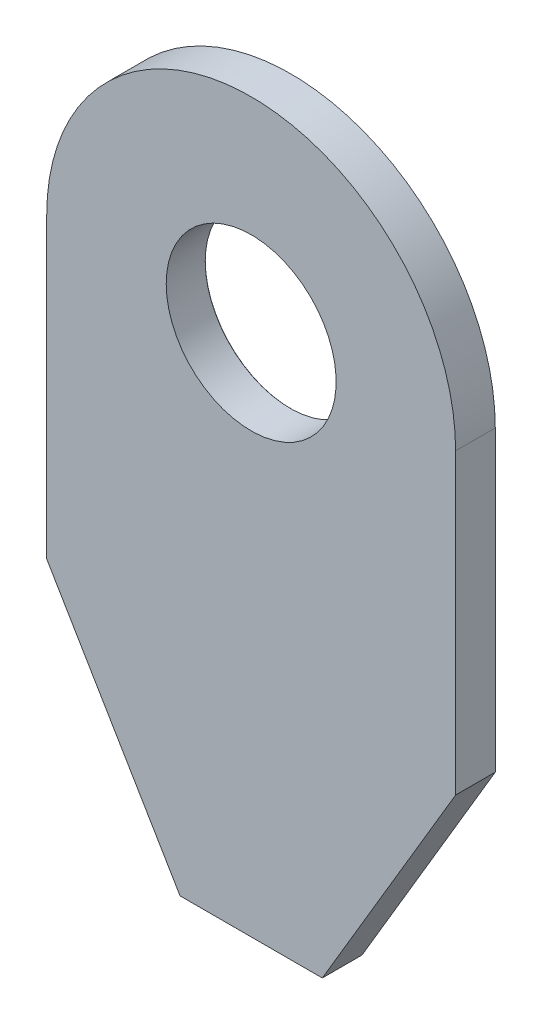
ISO-10303-21;
HEADER;
FILE_DESCRIPTION(('STEP AP214'),'2;1');
FILE_NAME('part.step','',(''),(''),'','','');
FILE_SCHEMA(('AUTOMOTIVE_DESIGN { 1 0 10303 214 1 1 1 1 }'));
ENDSEC;
DATA;
#1=APPLICATION_CONTEXT('core data for automotive mechanical design processes');
#2=APPLICATION_PROTOCOL_DEFINITION('international standard','automotive_design',2000,#1);
#3=PRODUCT_CONTEXT('',#1,'mechanical');
#4=PRODUCT('Part','Part','',(#3));
#5=PRODUCT_RELATED_PRODUCT_CATEGORY('part','',(#4));
#6=PRODUCT_DEFINITION_FORMATION('','',#4);
#7=PRODUCT_DEFINITION_CONTEXT('part definition',#1,'design');
#8=PRODUCT_DEFINITION('design','',#6,#7);
#9=PRODUCT_DEFINITION_SHAPE('','',#8);
#10=(LENGTH_UNIT() NAMED_UNIT(*) SI_UNIT(.MILLI.,.METRE.));
#11=(NAMED_UNIT(*) PLANE_ANGLE_UNIT() SI_UNIT($,.RADIAN.));
#12=(NAMED_UNIT(*) SI_UNIT($,.STERADIAN.) SOLID_ANGLE_UNIT());
#13=UNCERTAINTY_MEASURE_WITH_UNIT(LENGTH_MEASURE(1.E-05),#10,'distance_accuracy_value','');
#14=(GEOMETRIC_REPRESENTATION_CONTEXT(3) GLOBAL_UNCERTAINTY_ASSIGNED_CONTEXT((#13)) GLOBAL_UNIT_ASSIGNED_CONTEXT((#10,
#11,#12)) REPRESENTATION_CONTEXT('',''));
#15=CARTESIAN_POINT('',(0.,0.,0.));
#16=DIRECTION('',(0.,0.,1.));
#17=DIRECTION('',(1.,0.,0.));
#18=AXIS2_PLACEMENT_3D('',#15,#16,#17);
#19=CARTESIAN_POINT('',(-7.939999995,0.,1.54));
#20=DIRECTION('',(1.,0.,0.));
#21=DIRECTION('',(0.,1.,0.));
#22=AXIS2_PLACEMENT_3D('',#19,#20,#21);
#23=PLANE('',#22);
#24=DIRECTION('',(0.,-1.,0.));
#25=VECTOR('',#24,1.);
#26=CARTESIAN_POINT('',(-7.939999995,0.,0.));
#27=LINE('',#26,#25);
#28=CARTESIAN_POINT('',(-7.939999995,0.,0.));
#29=VERTEX_POINT('',#28);
#30=CARTESIAN_POINT('',(-7.939999995,-11.578447249966,0.));
#31=VERTEX_POINT('',#30);
#32=EDGE_CURVE('E162',#29,#31,#27,.T.);
#33=ORIENTED_EDGE('',*,*,#32,.T.);
#34=DIRECTION('',(0.,0.,-1.));
#35=VECTOR('',#34,1.);
#36=CARTESIAN_POINT('',(-7.939999995,-11.578447249966,1.54));
#37=LINE('',#36,#35);
#38=CARTESIAN_POINT('',(-7.939999995,-11.578447249966,1.54));
#39=VERTEX_POINT('',#38);
#40=EDGE_CURVE('E83',#39,#31,#37,.T.);
#41=ORIENTED_EDGE('',*,*,#40,.F.);
#42=DIRECTION('',(0.,-1.,0.));
#43=VECTOR('',#42,1.);
#44=CARTESIAN_POINT('',(-7.939999995,0.,1.54));
#45=LINE('',#44,#43);
#46=CARTESIAN_POINT('',(-7.939999995,0.,1.54));
#47=VERTEX_POINT('',#46);
#48=EDGE_CURVE('E181',#47,#39,#45,.T.);
#49=ORIENTED_EDGE('',*,*,#48,.F.);
#50=DIRECTION('',(0.,0.,-1.));
#51=VECTOR('',#50,1.);
#52=CARTESIAN_POINT('',(-7.939999995,0.,1.54));
#53=LINE('',#52,#51);
#54=EDGE_CURVE('E13',#47,#29,#53,.T.);
#55=ORIENTED_EDGE('',*,*,#54,.T.);
#56=EDGE_LOOP('',(#33,#41,#49,#55));
#57=FACE_BOUND('',#56,.T.);
#58=ADVANCED_FACE('F71',(#57),#23,.F.);
#59=CARTESIAN_POINT('',(-10.9547344142088,-6.48886302371263,1.54));
#60=DIRECTION('',(0.860389050200196,0.5096377951993,0.));
#61=DIRECTION('',(-0.5096377951993,0.860389050200196,0.));
#62=AXIS2_PLACEMENT_3D('',#59,#60,#61);
#63=PLANE('',#62);
#64=DIRECTION('',(0.5096377951993,-0.860389050200196,0.));
#65=VECTOR('',#64,1.);
#66=CARTESIAN_POINT('',(-10.9547344142088,-6.48886302371263,0.));
#67=LINE('',#66,#65);
#68=CARTESIAN_POINT('',(-2.76207999577511,-20.32,0.));
#69=VERTEX_POINT('',#68);
#70=EDGE_CURVE('E165',#31,#69,#67,.T.);
#71=ORIENTED_EDGE('',*,*,#70,.T.);
#72=DIRECTION('',(0.,0.,-1.));
#73=VECTOR('',#72,1.);
#74=CARTESIAN_POINT('',(-2.76207999577511,-20.32,1.54));
#75=LINE('',#74,#73);
#76=CARTESIAN_POINT('',(-2.76207999577511,-20.32,1.54));
#77=VERTEX_POINT('',#76);
#78=EDGE_CURVE('E152',#77,#69,#75,.T.);
#79=ORIENTED_EDGE('',*,*,#78,.F.);
#80=DIRECTION('',(0.5096377951993,-0.860389050200196,0.));
#81=VECTOR('',#80,1.);
#82=CARTESIAN_POINT('',(-10.9547344142088,-6.48886302371263,1.54));
#83=LINE('',#82,#81);
#84=EDGE_CURVE('E137',#39,#77,#83,.T.);
#85=ORIENTED_EDGE('',*,*,#84,.F.);
#86=ORIENTED_EDGE('',*,*,#40,.T.);
#87=EDGE_LOOP('',(#71,#79,#85,#86));
#88=FACE_BOUND('',#87,.T.);
#89=ADVANCED_FACE('F215',(#88),#63,.F.);
#90=CARTESIAN_POINT('',(0.,-20.32,1.54));
#91=DIRECTION('',(0.,1.,0.));
#92=DIRECTION('',(0.,0.,1.));
#93=AXIS2_PLACEMENT_3D('',#90,#91,#92);
#94=PLANE('',#93);
#95=DIRECTION('',(1.,0.,0.));
#96=VECTOR('',#95,1.);
#97=CARTESIAN_POINT('',(0.,-20.32,0.));
#98=LINE('',#97,#96);
#99=CARTESIAN_POINT('',(2.76207999577511,-20.32,0.));
#100=VERTEX_POINT('',#99);
#101=EDGE_CURVE('E147',#69,#100,#98,.T.);
#102=ORIENTED_EDGE('',*,*,#101,.T.);
#103=DIRECTION('',(0.,0.,-1.));
#104=VECTOR('',#103,1.);
#105=CARTESIAN_POINT('',(2.76207999577511,-20.32,1.54));
#106=LINE('',#105,#104);
#107=CARTESIAN_POINT('',(2.76207999577511,-20.32,1.54));
#108=VERTEX_POINT('',#107);
#109=EDGE_CURVE('E144',#108,#100,#106,.T.);
#110=ORIENTED_EDGE('',*,*,#109,.F.);
#111=DIRECTION('',(1.,0.,0.));
#112=VECTOR('',#111,1.);
#113=CARTESIAN_POINT('',(0.,-20.32,1.54));
#114=LINE('',#113,#112);
#115=EDGE_CURVE('E130',#77,#108,#114,.T.);
#116=ORIENTED_EDGE('',*,*,#115,.F.);
#117=ORIENTED_EDGE('',*,*,#78,.T.);
#118=EDGE_LOOP('',(#102,#110,#116,#117));
#119=FACE_BOUND('',#118,.T.);
#120=ADVANCED_FACE('F145',(#119),#94,.F.);
#121=CARTESIAN_POINT('',(10.9547344142088,-6.48886302371263,1.54));
#122=DIRECTION('',(0.860389050200196,-0.5096377951993,0.));
#123=DIRECTION('',(0.5096377951993,0.860389050200196,0.));
#124=AXIS2_PLACEMENT_3D('',#121,#122,#123);
#125=PLANE('',#124);
#126=DIRECTION('',(-0.5096377951993,-0.860389050200196,0.));
#127=VECTOR('',#126,1.);
#128=CARTESIAN_POINT('',(10.9547344142088,-6.48886302371263,0.));
#129=LINE('',#128,#127);
#130=CARTESIAN_POINT('',(7.939999995,-11.578447249966,0.));
#131=VERTEX_POINT('',#130);
#132=EDGE_CURVE('E182',#131,#100,#129,.T.);
#133=ORIENTED_EDGE('',*,*,#132,.F.);
#134=DIRECTION('',(0.,0.,-1.));
#135=VECTOR('',#134,1.);
#136=CARTESIAN_POINT('',(7.939999995,-11.578447249966,1.54));
#137=LINE('',#136,#135);
#138=CARTESIAN_POINT('',(7.939999995,-11.578447249966,1.54));
#139=VERTEX_POINT('',#138);
#140=EDGE_CURVE('E111',#139,#131,#137,.T.);
#141=ORIENTED_EDGE('',*,*,#140,.F.);
#142=DIRECTION('',(-0.5096377951993,-0.860389050200196,0.));
#143=VECTOR('',#142,1.);
#144=CARTESIAN_POINT('',(10.9547344142088,-6.48886302371263,1.54));
#145=LINE('',#144,#143);
#146=EDGE_CURVE('E135',#139,#108,#145,.T.);
#147=ORIENTED_EDGE('',*,*,#146,.T.);
#148=ORIENTED_EDGE('',*,*,#109,.T.);
#149=EDGE_LOOP('',(#133,#141,#147,#148));
#150=FACE_BOUND('',#149,.T.);
#151=ADVANCED_FACE('F154',(#150),#125,.T.);
#152=CARTESIAN_POINT('',(7.939999995,0.,1.54));
#153=DIRECTION('',(-1.,0.,0.));
#154=DIRECTION('',(0.,-1.,0.));
#155=AXIS2_PLACEMENT_3D('',#152,#153,#154);
#156=PLANE('',#155);
#157=DIRECTION('',(0.,1.,0.));
#158=VECTOR('',#157,1.);
#159=CARTESIAN_POINT('',(7.939999995,0.,0.));
#160=LINE('',#159,#158);
#161=CARTESIAN_POINT('',(7.939999995,0.,0.));
#162=VERTEX_POINT('',#161);
#163=EDGE_CURVE('E177',#131,#162,#160,.T.);
#164=ORIENTED_EDGE('',*,*,#163,.T.);
#165=DIRECTION('',(0.,0.,-1.));
#166=VECTOR('',#165,1.);
#167=CARTESIAN_POINT('',(7.939999995,0.,1.54));
#168=LINE('',#167,#166);
#169=CARTESIAN_POINT('',(7.939999995,0.,1.54));
#170=VERTEX_POINT('',#169);
#171=EDGE_CURVE('E92',#170,#162,#168,.T.);
#172=ORIENTED_EDGE('',*,*,#171,.F.);
#173=DIRECTION('',(0.,1.,0.));
#174=VECTOR('',#173,1.);
#175=CARTESIAN_POINT('',(7.939999995,0.,1.54));
#176=LINE('',#175,#174);
#177=EDGE_CURVE('E156',#139,#170,#176,.T.);
#178=ORIENTED_EDGE('',*,*,#177,.F.);
#179=ORIENTED_EDGE('',*,*,#140,.T.);
#180=EDGE_LOOP('',(#164,#172,#178,#179));
#181=FACE_BOUND('',#180,.T.);
#182=ADVANCED_FACE('F219',(#181),#156,.F.);
#183=CARTESIAN_POINT('',(0.,0.,0.));
#184=DIRECTION('',(0.,0.,1.));
#185=DIRECTION('',(1.,0.,0.));
#186=AXIS2_PLACEMENT_3D('',#183,#184,#185);
#187=PLANE('',#186);
#188=CARTESIAN_POINT('',(0.,0.,0.));
#189=DIRECTION('',(0.,0.,-1.));
#190=DIRECTION('',(-1.,0.,0.));
#191=AXIS2_PLACEMENT_3D('',#188,#189,#190);
#192=CIRCLE('',#191,3.325);
#193=CARTESIAN_POINT('',(-3.325,0.,0.));
#194=VERTEX_POINT('',#193);
#195=EDGE_CURVE('E205',#194,#194,#192,.T.);
#196=ORIENTED_EDGE('',*,*,#195,.F.);
#197=EDGE_LOOP('',(#196));
#198=FACE_BOUND('',#197,.T.);
#199=ORIENTED_EDGE('',*,*,#32,.F.);
#200=CARTESIAN_POINT('',(0.,0.,0.));
#201=DIRECTION('',(0.,0.,1.));
#202=DIRECTION('',(1.,0.,0.));
#203=AXIS2_PLACEMENT_3D('',#200,#201,#202);
#204=CIRCLE('',#203,7.93999999500001);
#205=EDGE_CURVE('E75',#162,#29,#204,.T.);
#206=ORIENTED_EDGE('',*,*,#205,.F.);
#207=ORIENTED_EDGE('',*,*,#163,.F.);
#208=ORIENTED_EDGE('',*,*,#132,.T.);
#209=ORIENTED_EDGE('',*,*,#101,.F.);
#210=ORIENTED_EDGE('',*,*,#70,.F.);
#211=EDGE_LOOP('',(#199,#206,#207,#208,#209,#210));
#212=FACE_BOUND('',#211,.T.);
#213=ADVANCED_FACE('F218',(#198,#212),#187,.F.);
#214=CARTESIAN_POINT('',(0.,0.,1.54));
#215=DIRECTION('',(0.,0.,1.));
#216=DIRECTION('',(1.,0.,0.));
#217=AXIS2_PLACEMENT_3D('',#214,#215,#216);
#218=PLANE('',#217);
#219=CARTESIAN_POINT('',(0.,0.,1.54));
#220=DIRECTION('',(0.,0.,-1.));
#221=DIRECTION('',(-1.,0.,0.));
#222=AXIS2_PLACEMENT_3D('',#219,#220,#221);
#223=CIRCLE('',#222,3.3);
#224=CARTESIAN_POINT('',(-3.3,0.,1.54));
#225=VERTEX_POINT('',#224);
#226=EDGE_CURVE('E195',#225,#225,#223,.T.);
#227=ORIENTED_EDGE('',*,*,#226,.T.);
#228=EDGE_LOOP('',(#227));
#229=FACE_BOUND('',#228,.T.);
#230=ORIENTED_EDGE('',*,*,#177,.T.);
#231=CARTESIAN_POINT('',(0.,0.,1.54));
#232=DIRECTION('',(0.,0.,1.));
#233=DIRECTION('',(1.,0.,0.));
#234=AXIS2_PLACEMENT_3D('',#231,#232,#233);
#235=CIRCLE('',#234,7.93999999500001);
#236=EDGE_CURVE('E166',#170,#47,#235,.T.);
#237=ORIENTED_EDGE('',*,*,#236,.T.);
#238=ORIENTED_EDGE('',*,*,#48,.T.);
#239=ORIENTED_EDGE('',*,*,#84,.T.);
#240=ORIENTED_EDGE('',*,*,#115,.T.);
#241=ORIENTED_EDGE('',*,*,#146,.F.);
#242=EDGE_LOOP('',(#230,#237,#238,#239,#240,#241));
#243=FACE_BOUND('',#242,.T.);
#244=ADVANCED_FACE('F133',(#229,#243),#218,.T.);
#245=CARTESIAN_POINT('',(0.,0.,1.54));
#246=DIRECTION('',(0.,0.,-1.));
#247=DIRECTION('',(-1.,0.,0.));
#248=AXIS2_PLACEMENT_3D('',#245,#246,#247);
#249=CYLINDRICAL_SURFACE('',#248,7.93999999500001);
#250=ORIENTED_EDGE('',*,*,#205,.T.);
#251=ORIENTED_EDGE('',*,*,#54,.F.);
#252=ORIENTED_EDGE('',*,*,#236,.F.);
#253=ORIENTED_EDGE('',*,*,#171,.T.);
#254=EDGE_LOOP('',(#250,#251,#252,#253));
#255=FACE_BOUND('',#254,.T.);
#256=ADVANCED_FACE('F73',(#255),#249,.T.);
#257=CARTESIAN_POINT('',(0.,0.,0.));
#258=DIRECTION('',(0.,0.,-1.));
#259=DIRECTION('',(-1.,0.,0.));
#260=AXIS2_PLACEMENT_3D('',#257,#258,#259);
#261=CYLINDRICAL_SURFACE('',#260,3.29999999999999);
#262=ORIENTED_EDGE('',*,*,#226,.F.);
#263=EDGE_LOOP('',(#262));
#264=FACE_BOUND('',#263,.T.);
#265=CARTESIAN_POINT('',(0.,0.,0.0249999999999972));
#266=DIRECTION('',(0.,0.,-1.));
#267=DIRECTION('',(-1.,0.,0.));
#268=AXIS2_PLACEMENT_3D('',#265,#266,#267);
#269=CIRCLE('',#268,3.29999999999999);
#270=CARTESIAN_POINT('',(-3.29999999999999,0.,0.0249999999999972));
#271=VERTEX_POINT('',#270);
#272=EDGE_CURVE('E199',#271,#271,#269,.T.);
#273=ORIENTED_EDGE('',*,*,#272,.T.);
#274=EDGE_LOOP('',(#273));
#275=FACE_BOUND('',#274,.T.);
#276=ADVANCED_FACE('F277',(#264,#275),#261,.F.);
#277=CARTESIAN_POINT('',(0.,0.,0.));
#278=DIRECTION('',(0.,0.,-1.));
#279=DIRECTION('',(-1.,0.,0.));
#280=AXIS2_PLACEMENT_3D('',#277,#278,#279);
#281=CONICAL_SURFACE('',#280,3.325,0.785398163397726);
#282=ORIENTED_EDGE('',*,*,#272,.F.);
#283=EDGE_LOOP('',(#282));
#284=FACE_BOUND('',#283,.T.);
#285=ORIENTED_EDGE('',*,*,#195,.T.);
#286=EDGE_LOOP('',(#285));
#287=FACE_BOUND('',#286,.T.);
#288=ADVANCED_FACE('F284',(#284,#287),#281,.F.);
#289=CLOSED_SHELL('',(#58,#89,#120,#151,#182,#213,#244,#256,#276,#288));
#290=MANIFOLD_SOLID_BREP('B2',#289);
#291=ADVANCED_BREP_SHAPE_REPRESENTATION('',(#18,#290),#14);
#292=SHAPE_DEFINITION_REPRESENTATION(#9,#291);
ENDSEC;
END-ISO-10303-21;
